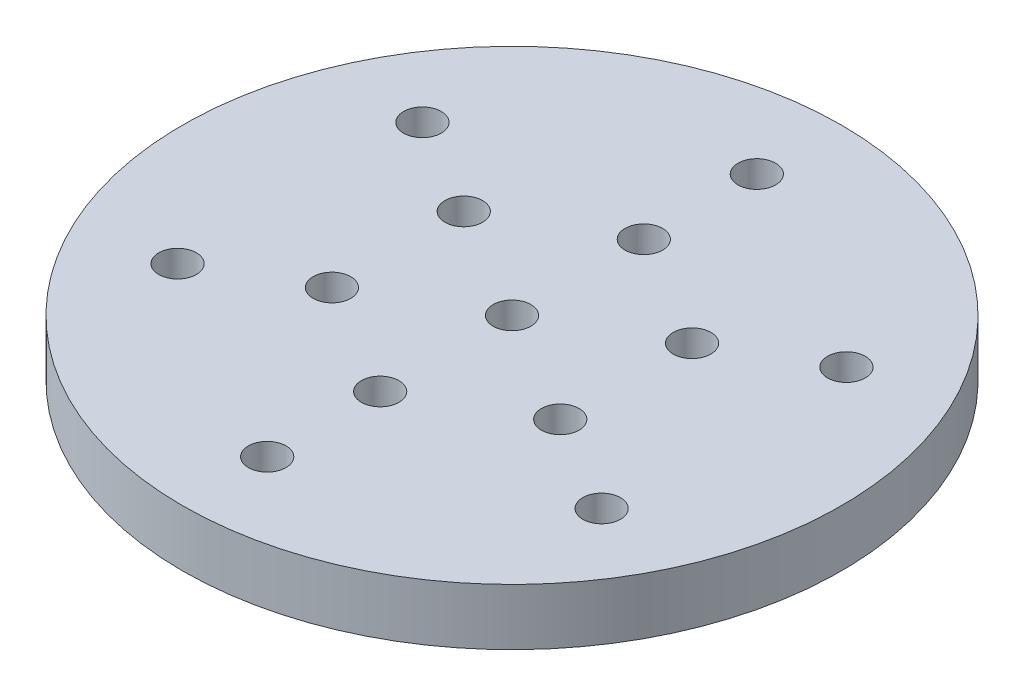
ISO-10303-21;
HEADER;
FILE_DESCRIPTION(('STEP AP214'),'2;1');
FILE_NAME('part.step','',(''),(''),'','','');
FILE_SCHEMA(('AUTOMOTIVE_DESIGN { 1 0 10303 214 1 1 1 1 }'));
ENDSEC;
DATA;
#1=APPLICATION_CONTEXT('core data for automotive mechanical design processes');
#2=APPLICATION_PROTOCOL_DEFINITION('international standard','automotive_design',2000,#1);
#3=PRODUCT_CONTEXT('',#1,'mechanical');
#4=PRODUCT('Part','Part','',(#3));
#5=PRODUCT_RELATED_PRODUCT_CATEGORY('part','',(#4));
#6=PRODUCT_DEFINITION_FORMATION('','',#4);
#7=PRODUCT_DEFINITION_CONTEXT('part definition',#1,'design');
#8=PRODUCT_DEFINITION('design','',#6,#7);
#9=PRODUCT_DEFINITION_SHAPE('','',#8);
#10=(LENGTH_UNIT() NAMED_UNIT(*) SI_UNIT(.MILLI.,.METRE.));
#11=(NAMED_UNIT(*) PLANE_ANGLE_UNIT() SI_UNIT($,.RADIAN.));
#12=(NAMED_UNIT(*) SI_UNIT($,.STERADIAN.) SOLID_ANGLE_UNIT());
#13=UNCERTAINTY_MEASURE_WITH_UNIT(LENGTH_MEASURE(1.E-05),#10,'distance_accuracy_value','');
#14=(GEOMETRIC_REPRESENTATION_CONTEXT(3) GLOBAL_UNCERTAINTY_ASSIGNED_CONTEXT((#13)) GLOBAL_UNIT_ASSIGNED_CONTEXT((#10,
#11,#12)) REPRESENTATION_CONTEXT('',''));
#15=CARTESIAN_POINT('',(0.,0.,0.));
#16=DIRECTION('',(0.,0.,1.));
#17=DIRECTION('',(1.,0.,0.));
#18=AXIS2_PLACEMENT_3D('',#15,#16,#17);
#19=CARTESIAN_POINT('',(0.,3.,0.));
#20=DIRECTION('',(0.,1.,0.));
#21=DIRECTION('',(0.,0.,1.));
#22=AXIS2_PLACEMENT_3D('',#19,#20,#21);
#23=PLANE('',#22);
#24=CARTESIAN_POINT('',(-6.06217782649107,3.,3.5));
#25=DIRECTION('',(0.,1.,0.));
#26=DIRECTION('',(0.,0.,1.));
#27=AXIS2_PLACEMENT_3D('',#24,#25,#26);
#28=CIRCLE('',#27,1.);
#29=CARTESIAN_POINT('',(-6.06217782649107,3.,4.5));
#30=VERTEX_POINT('',#29);
#31=EDGE_CURVE('E107',#30,#30,#28,.T.);
#32=ORIENTED_EDGE('',*,*,#31,.F.);
#33=EDGE_LOOP('',(#32));
#34=FACE_BOUND('',#33,.T.);
#35=CARTESIAN_POINT('',(6.06217782649107,3.,3.5));
#36=DIRECTION('',(0.,1.,0.));
#37=DIRECTION('',(0.,0.,1.));
#38=AXIS2_PLACEMENT_3D('',#35,#36,#37);
#39=CIRCLE('',#38,1.);
#40=CARTESIAN_POINT('',(6.06217782649107,3.,4.5));
#41=VERTEX_POINT('',#40);
#42=EDGE_CURVE('E95',#41,#41,#39,.T.);
#43=ORIENTED_EDGE('',*,*,#42,.F.);
#44=EDGE_LOOP('',(#43));
#45=FACE_BOUND('',#44,.T.);
#46=CARTESIAN_POINT('',(6.06217782649107,3.,-3.5));
#47=DIRECTION('',(0.,1.,0.));
#48=DIRECTION('',(0.,0.,1.));
#49=AXIS2_PLACEMENT_3D('',#46,#47,#48);
#50=CIRCLE('',#49,1.);
#51=CARTESIAN_POINT('',(6.06217782649107,3.,-2.5));
#52=VERTEX_POINT('',#51);
#53=EDGE_CURVE('E83',#52,#52,#50,.T.);
#54=ORIENTED_EDGE('',*,*,#53,.F.);
#55=EDGE_LOOP('',(#54));
#56=FACE_BOUND('',#55,.T.);
#57=CARTESIAN_POINT('',(-11.2583302491977,3.,6.50000000000001));
#58=DIRECTION('',(0.,1.,0.));
#59=DIRECTION('',(0.,0.,1.));
#60=AXIS2_PLACEMENT_3D('',#57,#58,#59);
#61=CIRCLE('',#60,1.);
#62=CARTESIAN_POINT('',(-11.2583302491977,3.,7.50000000000001));
#63=VERTEX_POINT('',#62);
#64=EDGE_CURVE('E71',#63,#63,#61,.T.);
#65=ORIENTED_EDGE('',*,*,#64,.F.);
#66=EDGE_LOOP('',(#65));
#67=FACE_BOUND('',#66,.T.);
#68=CARTESIAN_POINT('',(11.2583302491977,3.,6.5));
#69=DIRECTION('',(0.,1.,0.));
#70=DIRECTION('',(0.,0.,1.));
#71=AXIS2_PLACEMENT_3D('',#68,#69,#70);
#72=CIRCLE('',#71,1.);
#73=CARTESIAN_POINT('',(11.2583302491977,3.,7.5));
#74=VERTEX_POINT('',#73);
#75=EDGE_CURVE('E59',#74,#74,#72,.T.);
#76=ORIENTED_EDGE('',*,*,#75,.F.);
#77=EDGE_LOOP('',(#76));
#78=FACE_BOUND('',#77,.T.);
#79=CARTESIAN_POINT('',(11.2583302491977,3.,-6.5));
#80=DIRECTION('',(0.,1.,0.));
#81=DIRECTION('',(0.,0.,1.));
#82=AXIS2_PLACEMENT_3D('',#79,#80,#81);
#83=CIRCLE('',#82,1.);
#84=CARTESIAN_POINT('',(11.2583302491977,3.,-5.5));
#85=VERTEX_POINT('',#84);
#86=EDGE_CURVE('E47',#85,#85,#83,.T.);
#87=ORIENTED_EDGE('',*,*,#86,.F.);
#88=EDGE_LOOP('',(#87));
#89=FACE_BOUND('',#88,.T.);
#90=CARTESIAN_POINT('',(0.,3.,0.));
#91=DIRECTION('',(0.,1.,0.));
#92=DIRECTION('',(0.,0.,1.));
#93=AXIS2_PLACEMENT_3D('',#90,#91,#92);
#94=CIRCLE('',#93,17.5);
#95=CARTESIAN_POINT('',(0.,3.,17.5));
#96=VERTEX_POINT('',#95);
#97=EDGE_CURVE('E10',#96,#96,#94,.T.);
#98=ORIENTED_EDGE('',*,*,#97,.T.);
#99=EDGE_LOOP('',(#98));
#100=FACE_BOUND('',#99,.T.);
#101=CARTESIAN_POINT('',(0.,3.,-13.));
#102=DIRECTION('',(0.,1.,0.));
#103=DIRECTION('',(0.,0.,1.));
#104=AXIS2_PLACEMENT_3D('',#101,#102,#103);
#105=CIRCLE('',#104,1.);
#106=CARTESIAN_POINT('',(0.,3.,-12.));
#107=VERTEX_POINT('',#106);
#108=EDGE_CURVE('E42',#107,#107,#105,.T.);
#109=ORIENTED_EDGE('',*,*,#108,.F.);
#110=EDGE_LOOP('',(#109));
#111=FACE_BOUND('',#110,.T.);
#112=CARTESIAN_POINT('',(0.,3.,-7.));
#113=DIRECTION('',(0.,1.,0.));
#114=DIRECTION('',(0.,0.,1.));
#115=AXIS2_PLACEMENT_3D('',#112,#113,#114);
#116=CIRCLE('',#115,1.);
#117=CARTESIAN_POINT('',(0.,3.,-6.));
#118=VERTEX_POINT('',#117);
#119=EDGE_CURVE('E53',#118,#118,#116,.T.);
#120=ORIENTED_EDGE('',*,*,#119,.F.);
#121=EDGE_LOOP('',(#120));
#122=FACE_BOUND('',#121,.T.);
#123=CARTESIAN_POINT('',(0.,3.,13.));
#124=DIRECTION('',(0.,1.,0.));
#125=DIRECTION('',(0.,0.,1.));
#126=AXIS2_PLACEMENT_3D('',#123,#124,#125);
#127=CIRCLE('',#126,1.);
#128=CARTESIAN_POINT('',(0.,3.,14.));
#129=VERTEX_POINT('',#128);
#130=EDGE_CURVE('E65',#129,#129,#127,.T.);
#131=ORIENTED_EDGE('',*,*,#130,.F.);
#132=EDGE_LOOP('',(#131));
#133=FACE_BOUND('',#132,.T.);
#134=CARTESIAN_POINT('',(-11.2583302491977,3.,-6.49999999999999));
#135=DIRECTION('',(0.,1.,0.));
#136=DIRECTION('',(0.,0.,1.));
#137=AXIS2_PLACEMENT_3D('',#134,#135,#136);
#138=CIRCLE('',#137,1.);
#139=CARTESIAN_POINT('',(-11.2583302491977,3.,-5.49999999999999));
#140=VERTEX_POINT('',#139);
#141=EDGE_CURVE('E77',#140,#140,#138,.T.);
#142=ORIENTED_EDGE('',*,*,#141,.F.);
#143=EDGE_LOOP('',(#142));
#144=FACE_BOUND('',#143,.T.);
#145=CARTESIAN_POINT('',(0.,3.,0.));
#146=DIRECTION('',(0.,1.,0.));
#147=DIRECTION('',(0.,0.,1.));
#148=AXIS2_PLACEMENT_3D('',#145,#146,#147);
#149=CIRCLE('',#148,1.);
#150=CARTESIAN_POINT('',(0.,3.,1.));
#151=VERTEX_POINT('',#150);
#152=EDGE_CURVE('E89',#151,#151,#149,.T.);
#153=ORIENTED_EDGE('',*,*,#152,.F.);
#154=EDGE_LOOP('',(#153));
#155=FACE_BOUND('',#154,.T.);
#156=CARTESIAN_POINT('',(0.,3.,7.));
#157=DIRECTION('',(0.,1.,0.));
#158=DIRECTION('',(0.,0.,1.));
#159=AXIS2_PLACEMENT_3D('',#156,#157,#158);
#160=CIRCLE('',#159,1.);
#161=CARTESIAN_POINT('',(0.,3.,8.));
#162=VERTEX_POINT('',#161);
#163=EDGE_CURVE('E101',#162,#162,#160,.T.);
#164=ORIENTED_EDGE('',*,*,#163,.F.);
#165=EDGE_LOOP('',(#164));
#166=FACE_BOUND('',#165,.T.);
#167=CARTESIAN_POINT('',(-6.06217782649107,3.,-3.5));
#168=DIRECTION('',(0.,1.,0.));
#169=DIRECTION('',(0.,0.,1.));
#170=AXIS2_PLACEMENT_3D('',#167,#168,#169);
#171=CIRCLE('',#170,1.);
#172=CARTESIAN_POINT('',(-6.06217782649107,3.,-2.5));
#173=VERTEX_POINT('',#172);
#174=EDGE_CURVE('E113',#173,#173,#171,.T.);
#175=ORIENTED_EDGE('',*,*,#174,.F.);
#176=EDGE_LOOP('',(#175));
#177=FACE_BOUND('',#176,.T.);
#178=ADVANCED_FACE('F31',(#34,#45,#56,#67,#78,#89,#100,#111,#122,#133,#144,#155,#166,#177),#23,.T.);
#179=CARTESIAN_POINT('',(0.,0.,0.));
#180=DIRECTION('',(0.,1.,0.));
#181=DIRECTION('',(0.,0.,1.));
#182=AXIS2_PLACEMENT_3D('',#179,#180,#181);
#183=PLANE('',#182);
#184=CARTESIAN_POINT('',(0.,0.,0.));
#185=DIRECTION('',(0.,1.,0.));
#186=DIRECTION('',(0.,0.,1.));
#187=AXIS2_PLACEMENT_3D('',#184,#185,#186);
#188=CIRCLE('',#187,17.5);
#189=CARTESIAN_POINT('',(0.,0.,17.5));
#190=VERTEX_POINT('',#189);
#191=EDGE_CURVE('E35',#190,#190,#188,.T.);
#192=ORIENTED_EDGE('',*,*,#191,.F.);
#193=EDGE_LOOP('',(#192));
#194=FACE_BOUND('',#193,.T.);
#195=CARTESIAN_POINT('',(0.,0.,-13.));
#196=DIRECTION('',(0.,1.,0.));
#197=DIRECTION('',(0.,0.,1.));
#198=AXIS2_PLACEMENT_3D('',#195,#196,#197);
#199=CIRCLE('',#198,1.);
#200=CARTESIAN_POINT('',(0.,0.,-12.));
#201=VERTEX_POINT('',#200);
#202=EDGE_CURVE('E44',#201,#201,#199,.T.);
#203=ORIENTED_EDGE('',*,*,#202,.T.);
#204=EDGE_LOOP('',(#203));
#205=FACE_BOUND('',#204,.T.);
#206=CARTESIAN_POINT('',(11.2583302491977,0.,-6.5));
#207=DIRECTION('',(0.,1.,0.));
#208=DIRECTION('',(0.,0.,1.));
#209=AXIS2_PLACEMENT_3D('',#206,#207,#208);
#210=CIRCLE('',#209,1.);
#211=CARTESIAN_POINT('',(11.2583302491977,0.,-5.5));
#212=VERTEX_POINT('',#211);
#213=EDGE_CURVE('E50',#212,#212,#210,.T.);
#214=ORIENTED_EDGE('',*,*,#213,.T.);
#215=EDGE_LOOP('',(#214));
#216=FACE_BOUND('',#215,.T.);
#217=CARTESIAN_POINT('',(0.,0.,-7.));
#218=DIRECTION('',(0.,1.,0.));
#219=DIRECTION('',(0.,0.,1.));
#220=AXIS2_PLACEMENT_3D('',#217,#218,#219);
#221=CIRCLE('',#220,1.);
#222=CARTESIAN_POINT('',(0.,0.,-6.));
#223=VERTEX_POINT('',#222);
#224=EDGE_CURVE('E56',#223,#223,#221,.T.);
#225=ORIENTED_EDGE('',*,*,#224,.T.);
#226=EDGE_LOOP('',(#225));
#227=FACE_BOUND('',#226,.T.);
#228=CARTESIAN_POINT('',(11.2583302491977,0.,6.5));
#229=DIRECTION('',(0.,1.,0.));
#230=DIRECTION('',(0.,0.,1.));
#231=AXIS2_PLACEMENT_3D('',#228,#229,#230);
#232=CIRCLE('',#231,1.);
#233=CARTESIAN_POINT('',(11.2583302491977,0.,7.5));
#234=VERTEX_POINT('',#233);
#235=EDGE_CURVE('E62',#234,#234,#232,.T.);
#236=ORIENTED_EDGE('',*,*,#235,.T.);
#237=EDGE_LOOP('',(#236));
#238=FACE_BOUND('',#237,.T.);
#239=CARTESIAN_POINT('',(0.,0.,13.));
#240=DIRECTION('',(0.,1.,0.));
#241=DIRECTION('',(0.,0.,1.));
#242=AXIS2_PLACEMENT_3D('',#239,#240,#241);
#243=CIRCLE('',#242,1.);
#244=CARTESIAN_POINT('',(0.,0.,14.));
#245=VERTEX_POINT('',#244);
#246=EDGE_CURVE('E68',#245,#245,#243,.T.);
#247=ORIENTED_EDGE('',*,*,#246,.T.);
#248=EDGE_LOOP('',(#247));
#249=FACE_BOUND('',#248,.T.);
#250=CARTESIAN_POINT('',(-11.2583302491977,0.,6.50000000000001));
#251=DIRECTION('',(0.,1.,0.));
#252=DIRECTION('',(0.,0.,1.));
#253=AXIS2_PLACEMENT_3D('',#250,#251,#252);
#254=CIRCLE('',#253,1.);
#255=CARTESIAN_POINT('',(-11.2583302491977,0.,7.50000000000001));
#256=VERTEX_POINT('',#255);
#257=EDGE_CURVE('E74',#256,#256,#254,.T.);
#258=ORIENTED_EDGE('',*,*,#257,.T.);
#259=EDGE_LOOP('',(#258));
#260=FACE_BOUND('',#259,.T.);
#261=CARTESIAN_POINT('',(-11.2583302491977,0.,-6.49999999999999));
#262=DIRECTION('',(0.,1.,0.));
#263=DIRECTION('',(0.,0.,1.));
#264=AXIS2_PLACEMENT_3D('',#261,#262,#263);
#265=CIRCLE('',#264,1.);
#266=CARTESIAN_POINT('',(-11.2583302491977,0.,-5.49999999999999));
#267=VERTEX_POINT('',#266);
#268=EDGE_CURVE('E80',#267,#267,#265,.T.);
#269=ORIENTED_EDGE('',*,*,#268,.T.);
#270=EDGE_LOOP('',(#269));
#271=FACE_BOUND('',#270,.T.);
#272=CARTESIAN_POINT('',(6.06217782649107,0.,-3.5));
#273=DIRECTION('',(0.,1.,0.));
#274=DIRECTION('',(0.,0.,1.));
#275=AXIS2_PLACEMENT_3D('',#272,#273,#274);
#276=CIRCLE('',#275,1.);
#277=CARTESIAN_POINT('',(6.06217782649107,0.,-2.5));
#278=VERTEX_POINT('',#277);
#279=EDGE_CURVE('E86',#278,#278,#276,.T.);
#280=ORIENTED_EDGE('',*,*,#279,.T.);
#281=EDGE_LOOP('',(#280));
#282=FACE_BOUND('',#281,.T.);
#283=CARTESIAN_POINT('',(0.,0.,0.));
#284=DIRECTION('',(0.,1.,0.));
#285=DIRECTION('',(0.,0.,1.));
#286=AXIS2_PLACEMENT_3D('',#283,#284,#285);
#287=CIRCLE('',#286,1.);
#288=CARTESIAN_POINT('',(0.,0.,1.));
#289=VERTEX_POINT('',#288);
#290=EDGE_CURVE('E92',#289,#289,#287,.T.);
#291=ORIENTED_EDGE('',*,*,#290,.T.);
#292=EDGE_LOOP('',(#291));
#293=FACE_BOUND('',#292,.T.);
#294=CARTESIAN_POINT('',(6.06217782649107,0.,3.5));
#295=DIRECTION('',(0.,1.,0.));
#296=DIRECTION('',(0.,0.,1.));
#297=AXIS2_PLACEMENT_3D('',#294,#295,#296);
#298=CIRCLE('',#297,1.);
#299=CARTESIAN_POINT('',(6.06217782649107,0.,4.5));
#300=VERTEX_POINT('',#299);
#301=EDGE_CURVE('E98',#300,#300,#298,.T.);
#302=ORIENTED_EDGE('',*,*,#301,.T.);
#303=EDGE_LOOP('',(#302));
#304=FACE_BOUND('',#303,.T.);
#305=CARTESIAN_POINT('',(0.,0.,7.));
#306=DIRECTION('',(0.,1.,0.));
#307=DIRECTION('',(0.,0.,1.));
#308=AXIS2_PLACEMENT_3D('',#305,#306,#307);
#309=CIRCLE('',#308,1.);
#310=CARTESIAN_POINT('',(0.,0.,8.));
#311=VERTEX_POINT('',#310);
#312=EDGE_CURVE('E104',#311,#311,#309,.T.);
#313=ORIENTED_EDGE('',*,*,#312,.T.);
#314=EDGE_LOOP('',(#313));
#315=FACE_BOUND('',#314,.T.);
#316=CARTESIAN_POINT('',(-6.06217782649107,0.,3.5));
#317=DIRECTION('',(0.,1.,0.));
#318=DIRECTION('',(0.,0.,1.));
#319=AXIS2_PLACEMENT_3D('',#316,#317,#318);
#320=CIRCLE('',#319,1.);
#321=CARTESIAN_POINT('',(-6.06217782649107,0.,4.5));
#322=VERTEX_POINT('',#321);
#323=EDGE_CURVE('E110',#322,#322,#320,.T.);
#324=ORIENTED_EDGE('',*,*,#323,.T.);
#325=EDGE_LOOP('',(#324));
#326=FACE_BOUND('',#325,.T.);
#327=CARTESIAN_POINT('',(-6.06217782649107,0.,-3.5));
#328=DIRECTION('',(0.,1.,0.));
#329=DIRECTION('',(0.,0.,1.));
#330=AXIS2_PLACEMENT_3D('',#327,#328,#329);
#331=CIRCLE('',#330,1.);
#332=CARTESIAN_POINT('',(-6.06217782649107,0.,-2.5));
#333=VERTEX_POINT('',#332);
#334=EDGE_CURVE('E116',#333,#333,#331,.T.);
#335=ORIENTED_EDGE('',*,*,#334,.T.);
#336=EDGE_LOOP('',(#335));
#337=FACE_BOUND('',#336,.T.);
#338=ADVANCED_FACE('F126',(#194,#205,#216,#227,#238,#249,#260,#271,#282,#293,#304,#315,#326,
#337),#183,.F.);
#339=CARTESIAN_POINT('',(0.,3.,0.));
#340=DIRECTION('',(0.,-1.,0.));
#341=DIRECTION('',(0.,0.,-1.));
#342=AXIS2_PLACEMENT_3D('',#339,#340,#341);
#343=CYLINDRICAL_SURFACE('',#342,17.5);
#344=ORIENTED_EDGE('',*,*,#97,.F.);
#345=EDGE_LOOP('',(#344));
#346=FACE_BOUND('',#345,.T.);
#347=ORIENTED_EDGE('',*,*,#191,.T.);
#348=EDGE_LOOP('',(#347));
#349=FACE_BOUND('',#348,.T.);
#350=ADVANCED_FACE('F33',(#346,#349),#343,.T.);
#351=CARTESIAN_POINT('',(0.,3.,-13.));
#352=DIRECTION('',(0.,-1.,0.));
#353=DIRECTION('',(0.,0.,-1.));
#354=AXIS2_PLACEMENT_3D('',#351,#352,#353);
#355=CYLINDRICAL_SURFACE('',#354,1.);
#356=ORIENTED_EDGE('',*,*,#108,.T.);
#357=EDGE_LOOP('',(#356));
#358=FACE_BOUND('',#357,.T.);
#359=ORIENTED_EDGE('',*,*,#202,.F.);
#360=EDGE_LOOP('',(#359));
#361=FACE_BOUND('',#360,.T.);
#362=ADVANCED_FACE('F136',(#358,#361),#355,.F.);
#363=CARTESIAN_POINT('',(11.2583302491977,3.,-6.5));
#364=DIRECTION('',(0.,-1.,0.));
#365=DIRECTION('',(0.,0.,-1.));
#366=AXIS2_PLACEMENT_3D('',#363,#364,#365);
#367=CYLINDRICAL_SURFACE('',#366,1.);
#368=ORIENTED_EDGE('',*,*,#86,.T.);
#369=EDGE_LOOP('',(#368));
#370=FACE_BOUND('',#369,.T.);
#371=ORIENTED_EDGE('',*,*,#213,.F.);
#372=EDGE_LOOP('',(#371));
#373=FACE_BOUND('',#372,.T.);
#374=ADVANCED_FACE('F139',(#370,#373),#367,.F.);
#375=CARTESIAN_POINT('',(0.,3.,-7.));
#376=DIRECTION('',(0.,-1.,0.));
#377=DIRECTION('',(0.,0.,-1.));
#378=AXIS2_PLACEMENT_3D('',#375,#376,#377);
#379=CYLINDRICAL_SURFACE('',#378,1.);
#380=ORIENTED_EDGE('',*,*,#119,.T.);
#381=EDGE_LOOP('',(#380));
#382=FACE_BOUND('',#381,.T.);
#383=ORIENTED_EDGE('',*,*,#224,.F.);
#384=EDGE_LOOP('',(#383));
#385=FACE_BOUND('',#384,.T.);
#386=ADVANCED_FACE('F143',(#382,#385),#379,.F.);
#387=CARTESIAN_POINT('',(11.2583302491977,3.,6.5));
#388=DIRECTION('',(0.,-1.,0.));
#389=DIRECTION('',(0.,0.,-1.));
#390=AXIS2_PLACEMENT_3D('',#387,#388,#389);
#391=CYLINDRICAL_SURFACE('',#390,1.);
#392=ORIENTED_EDGE('',*,*,#75,.T.);
#393=EDGE_LOOP('',(#392));
#394=FACE_BOUND('',#393,.T.);
#395=ORIENTED_EDGE('',*,*,#235,.F.);
#396=EDGE_LOOP('',(#395));
#397=FACE_BOUND('',#396,.T.);
#398=ADVANCED_FACE('F147',(#394,#397),#391,.F.);
#399=CARTESIAN_POINT('',(0.,3.,13.));
#400=DIRECTION('',(0.,-1.,0.));
#401=DIRECTION('',(0.,0.,-1.));
#402=AXIS2_PLACEMENT_3D('',#399,#400,#401);
#403=CYLINDRICAL_SURFACE('',#402,1.);
#404=ORIENTED_EDGE('',*,*,#130,.T.);
#405=EDGE_LOOP('',(#404));
#406=FACE_BOUND('',#405,.T.);
#407=ORIENTED_EDGE('',*,*,#246,.F.);
#408=EDGE_LOOP('',(#407));
#409=FACE_BOUND('',#408,.T.);
#410=ADVANCED_FACE('F151',(#406,#409),#403,.F.);
#411=CARTESIAN_POINT('',(-11.2583302491977,3.,6.50000000000001));
#412=DIRECTION('',(0.,-1.,0.));
#413=DIRECTION('',(0.,0.,-1.));
#414=AXIS2_PLACEMENT_3D('',#411,#412,#413);
#415=CYLINDRICAL_SURFACE('',#414,1.);
#416=ORIENTED_EDGE('',*,*,#64,.T.);
#417=EDGE_LOOP('',(#416));
#418=FACE_BOUND('',#417,.T.);
#419=ORIENTED_EDGE('',*,*,#257,.F.);
#420=EDGE_LOOP('',(#419));
#421=FACE_BOUND('',#420,.T.);
#422=ADVANCED_FACE('F155',(#418,#421),#415,.F.);
#423=CARTESIAN_POINT('',(-11.2583302491977,3.,-6.49999999999999));
#424=DIRECTION('',(0.,-1.,0.));
#425=DIRECTION('',(0.,0.,-1.));
#426=AXIS2_PLACEMENT_3D('',#423,#424,#425);
#427=CYLINDRICAL_SURFACE('',#426,1.);
#428=ORIENTED_EDGE('',*,*,#141,.T.);
#429=EDGE_LOOP('',(#428));
#430=FACE_BOUND('',#429,.T.);
#431=ORIENTED_EDGE('',*,*,#268,.F.);
#432=EDGE_LOOP('',(#431));
#433=FACE_BOUND('',#432,.T.);
#434=ADVANCED_FACE('F159',(#430,#433),#427,.F.);
#435=CARTESIAN_POINT('',(6.06217782649107,3.,-3.5));
#436=DIRECTION('',(0.,-1.,0.));
#437=DIRECTION('',(0.,0.,-1.));
#438=AXIS2_PLACEMENT_3D('',#435,#436,#437);
#439=CYLINDRICAL_SURFACE('',#438,1.);
#440=ORIENTED_EDGE('',*,*,#53,.T.);
#441=EDGE_LOOP('',(#440));
#442=FACE_BOUND('',#441,.T.);
#443=ORIENTED_EDGE('',*,*,#279,.F.);
#444=EDGE_LOOP('',(#443));
#445=FACE_BOUND('',#444,.T.);
#446=ADVANCED_FACE('F163',(#442,#445),#439,.F.);
#447=CARTESIAN_POINT('',(0.,3.,0.));
#448=DIRECTION('',(0.,-1.,0.));
#449=DIRECTION('',(0.,0.,-1.));
#450=AXIS2_PLACEMENT_3D('',#447,#448,#449);
#451=CYLINDRICAL_SURFACE('',#450,1.);
#452=ORIENTED_EDGE('',*,*,#152,.T.);
#453=EDGE_LOOP('',(#452));
#454=FACE_BOUND('',#453,.T.);
#455=ORIENTED_EDGE('',*,*,#290,.F.);
#456=EDGE_LOOP('',(#455));
#457=FACE_BOUND('',#456,.T.);
#458=ADVANCED_FACE('F167',(#454,#457),#451,.F.);
#459=CARTESIAN_POINT('',(6.06217782649107,3.,3.5));
#460=DIRECTION('',(0.,-1.,0.));
#461=DIRECTION('',(0.,0.,-1.));
#462=AXIS2_PLACEMENT_3D('',#459,#460,#461);
#463=CYLINDRICAL_SURFACE('',#462,1.);
#464=ORIENTED_EDGE('',*,*,#42,.T.);
#465=EDGE_LOOP('',(#464));
#466=FACE_BOUND('',#465,.T.);
#467=ORIENTED_EDGE('',*,*,#301,.F.);
#468=EDGE_LOOP('',(#467));
#469=FACE_BOUND('',#468,.T.);
#470=ADVANCED_FACE('F171',(#466,#469),#463,.F.);
#471=CARTESIAN_POINT('',(0.,3.,7.));
#472=DIRECTION('',(0.,-1.,0.));
#473=DIRECTION('',(0.,0.,-1.));
#474=AXIS2_PLACEMENT_3D('',#471,#472,#473);
#475=CYLINDRICAL_SURFACE('',#474,1.);
#476=ORIENTED_EDGE('',*,*,#163,.T.);
#477=EDGE_LOOP('',(#476));
#478=FACE_BOUND('',#477,.T.);
#479=ORIENTED_EDGE('',*,*,#312,.F.);
#480=EDGE_LOOP('',(#479));
#481=FACE_BOUND('',#480,.T.);
#482=ADVANCED_FACE('F175',(#478,#481),#475,.F.);
#483=CARTESIAN_POINT('',(-6.06217782649107,3.,3.5));
#484=DIRECTION('',(0.,-1.,0.));
#485=DIRECTION('',(0.,0.,-1.));
#486=AXIS2_PLACEMENT_3D('',#483,#484,#485);
#487=CYLINDRICAL_SURFACE('',#486,1.);
#488=ORIENTED_EDGE('',*,*,#31,.T.);
#489=EDGE_LOOP('',(#488));
#490=FACE_BOUND('',#489,.T.);
#491=ORIENTED_EDGE('',*,*,#323,.F.);
#492=EDGE_LOOP('',(#491));
#493=FACE_BOUND('',#492,.T.);
#494=ADVANCED_FACE('F179',(#490,#493),#487,.F.);
#495=CARTESIAN_POINT('',(-6.06217782649107,3.,-3.5));
#496=DIRECTION('',(0.,-1.,0.));
#497=DIRECTION('',(0.,0.,-1.));
#498=AXIS2_PLACEMENT_3D('',#495,#496,#497);
#499=CYLINDRICAL_SURFACE('',#498,1.);
#500=ORIENTED_EDGE('',*,*,#174,.T.);
#501=EDGE_LOOP('',(#500));
#502=FACE_BOUND('',#501,.T.);
#503=ORIENTED_EDGE('',*,*,#334,.F.);
#504=EDGE_LOOP('',(#503));
#505=FACE_BOUND('',#504,.T.);
#506=ADVANCED_FACE('F122',(#502,#505),#499,.F.);
#507=CLOSED_SHELL('',(#178,#338,#350,#362,#374,#386,#398,#410,#422,#434,#446,#458,#470,#482,
#494,#506));
#508=MANIFOLD_SOLID_BREP('B2',#507);
#509=ADVANCED_BREP_SHAPE_REPRESENTATION('',(#18,#508),#14);
#510=SHAPE_DEFINITION_REPRESENTATION(#9,#509);
ENDSEC;
END-ISO-10303-21;
